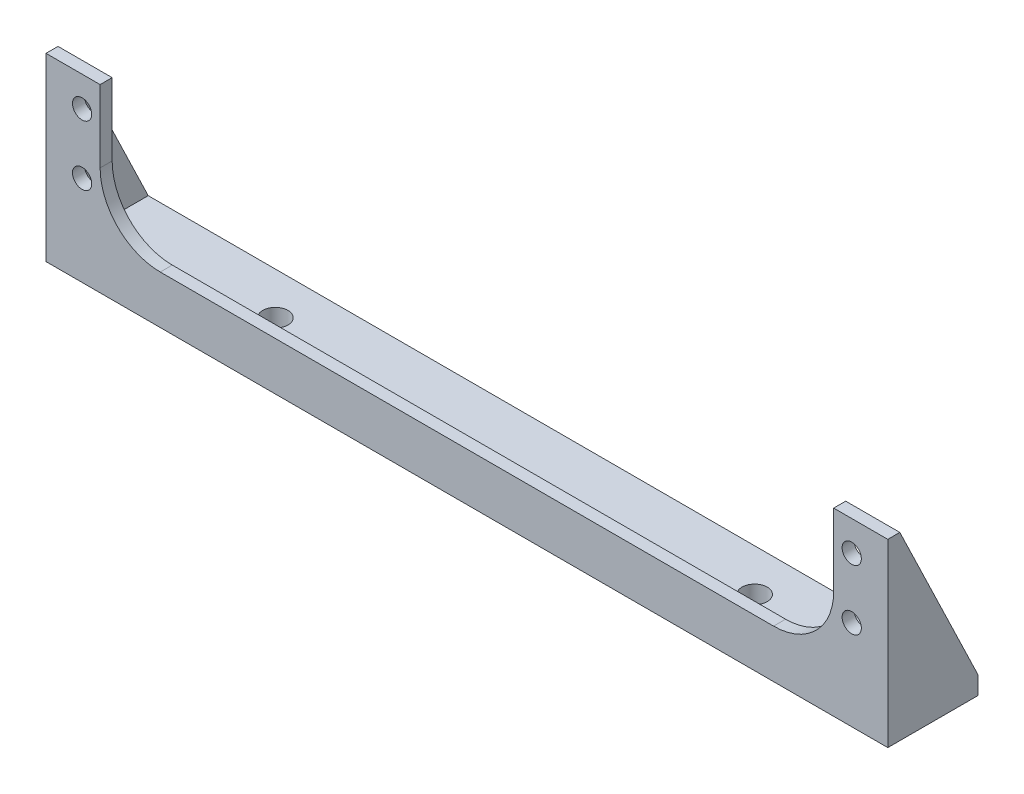
ISO-10303-21;
HEADER;
FILE_DESCRIPTION(('STEP AP214'),'2;1');
FILE_NAME('part.step','',(''),(''),'','','');
FILE_SCHEMA(('AUTOMOTIVE_DESIGN { 1 0 10303 214 1 1 1 1 }'));
ENDSEC;
DATA;
#1=APPLICATION_CONTEXT('core data for automotive mechanical design processes');
#2=APPLICATION_PROTOCOL_DEFINITION('international standard','automotive_design',2000,#1);
#3=PRODUCT_CONTEXT('',#1,'mechanical');
#4=PRODUCT('Part','Part','',(#3));
#5=PRODUCT_RELATED_PRODUCT_CATEGORY('part','',(#4));
#6=PRODUCT_DEFINITION_FORMATION('','',#4);
#7=PRODUCT_DEFINITION_CONTEXT('part definition',#1,'design');
#8=PRODUCT_DEFINITION('design','',#6,#7);
#9=PRODUCT_DEFINITION_SHAPE('','',#8);
#10=(LENGTH_UNIT() NAMED_UNIT(*) SI_UNIT(.MILLI.,.METRE.));
#11=(NAMED_UNIT(*) PLANE_ANGLE_UNIT() SI_UNIT($,.RADIAN.));
#12=(NAMED_UNIT(*) SI_UNIT($,.STERADIAN.) SOLID_ANGLE_UNIT());
#13=UNCERTAINTY_MEASURE_WITH_UNIT(LENGTH_MEASURE(1.E-05),#10,'distance_accuracy_value','');
#14=(GEOMETRIC_REPRESENTATION_CONTEXT(3) GLOBAL_UNCERTAINTY_ASSIGNED_CONTEXT((#13)) GLOBAL_UNIT_ASSIGNED_CONTEXT((#10,
#11,#12)) REPRESENTATION_CONTEXT('',''));
#15=CARTESIAN_POINT('',(0.,0.,0.));
#16=DIRECTION('',(0.,0.,1.));
#17=DIRECTION('',(1.,0.,0.));
#18=AXIS2_PLACEMENT_3D('',#15,#16,#17);
#19=CARTESIAN_POINT('',(-104.350253807107,3.,-17.8934010152284));
#20=DIRECTION('',(0.,-1.,0.));
#21=DIRECTION('',(0.,0.,-1.));
#22=AXIS2_PLACEMENT_3D('',#19,#20,#21);
#23=PLANE('',#22);
#24=CARTESIAN_POINT('',(-83.2002538071066,3.,4.10659898477157));
#25=DIRECTION('',(0.,1.,0.));
#26=DIRECTION('',(0.,0.,1.));
#27=AXIS2_PLACEMENT_3D('',#24,#25,#26);
#28=CIRCLE('',#27,2.1);
#29=CARTESIAN_POINT('',(-83.2002538071066,3.,6.20659898477158));
#30=VERTEX_POINT('',#29);
#31=EDGE_CURVE('E403',#30,#30,#28,.T.);
#32=ORIENTED_EDGE('',*,*,#31,.F.);
#33=EDGE_LOOP('',(#32));
#34=FACE_BOUND('',#33,.T.);
#35=CARTESIAN_POINT('',(-3.50025380710657,3.,4.10659898477157));
#36=DIRECTION('',(0.,1.,0.));
#37=DIRECTION('',(0.,0.,1.));
#38=AXIS2_PLACEMENT_3D('',#35,#36,#37);
#39=CIRCLE('',#38,2.1);
#40=CARTESIAN_POINT('',(-3.50025380710657,3.,6.20659898477157));
#41=VERTEX_POINT('',#40);
#42=EDGE_CURVE('E409',#41,#41,#39,.T.);
#43=ORIENTED_EDGE('',*,*,#42,.F.);
#44=EDGE_LOOP('',(#43));
#45=FACE_BOUND('',#44,.T.);
#46=DIRECTION('',(0.,0.,-1.));
#47=VECTOR('',#46,1.);
#48=CARTESIAN_POINT('',(-111.350253807107,3.,10.1065989847716));
#49=LINE('',#48,#47);
#50=CARTESIAN_POINT('',(-111.350253807107,3.,8.10659898477147));
#51=VERTEX_POINT('',#50);
#52=CARTESIAN_POINT('',(-111.350253807107,3.,-2.89340101522843));
#53=VERTEX_POINT('',#52);
#54=EDGE_CURVE('E260',#51,#53,#49,.T.);
#55=ORIENTED_EDGE('',*,*,#54,.F.);
#56=DIRECTION('',(-1.,0.,0.));
#57=VECTOR('',#56,1.);
#58=CARTESIAN_POINT('',(24.6497461928934,3.,8.10659898477134));
#59=LINE('',#58,#57);
#60=CARTESIAN_POINT('',(24.6497461928934,3.,8.10659898477134));
#61=VERTEX_POINT('',#60);
#62=EDGE_CURVE('E48',#51,#61,#59,.F.);
#63=ORIENTED_EDGE('',*,*,#62,.T.);
#64=DIRECTION('',(0.,0.,1.));
#65=VECTOR('',#64,1.);
#66=CARTESIAN_POINT('',(24.6497461928934,3.,10.1065989847714));
#67=LINE('',#66,#65);
#68=CARTESIAN_POINT('',(24.6497461928934,3.,-2.89340101522843));
#69=VERTEX_POINT('',#68);
#70=EDGE_CURVE('E259',#69,#61,#67,.T.);
#71=ORIENTED_EDGE('',*,*,#70,.F.);
#72=DIRECTION('',(1.,0.,0.));
#73=VECTOR('',#72,1.);
#74=CARTESIAN_POINT('',(-113.350253807107,3.,-2.89340101522843));
#75=LINE('',#74,#73);
#76=EDGE_CURVE('E170',#53,#69,#75,.T.);
#77=ORIENTED_EDGE('',*,*,#76,.F.);
#78=EDGE_LOOP('',(#55,#63,#71,#77));
#79=FACE_BOUND('',#78,.T.);
#80=ADVANCED_FACE('F39',(#34,#45,#79),#23,.F.);
#81=CARTESIAN_POINT('',(0.,30.,0.));
#82=DIRECTION('',(0.,1.,0.));
#83=DIRECTION('',(0.,0.,1.));
#84=AXIS2_PLACEMENT_3D('',#81,#82,#83);
#85=PLANE('',#84);
#86=DIRECTION('',(-1.,0.,0.));
#87=VECTOR('',#86,1.);
#88=CARTESIAN_POINT('',(26.6497461928934,30.,10.1065989847713));
#89=LINE('',#88,#87);
#90=CARTESIAN_POINT('',(-111.350253807107,30.,10.1065989847716));
#91=VERTEX_POINT('',#90);
#92=CARTESIAN_POINT('',(-113.350253807107,30.,10.1065989847715));
#93=VERTEX_POINT('',#92);
#94=EDGE_CURVE('E172',#91,#93,#89,.T.);
#95=ORIENTED_EDGE('',*,*,#94,.T.);
#96=DIRECTION('',(0.,0.,1.));
#97=VECTOR('',#96,1.);
#98=CARTESIAN_POINT('',(-113.350253807107,30.,-2.89340101522843));
#99=LINE('',#98,#97);
#100=CARTESIAN_POINT('',(-113.350253807107,30.,12.1065989847716));
#101=VERTEX_POINT('',#100);
#102=EDGE_CURVE('E286',#93,#101,#99,.T.);
#103=ORIENTED_EDGE('',*,*,#102,.T.);
#104=DIRECTION('',(1.,0.,0.));
#105=VECTOR('',#104,1.);
#106=CARTESIAN_POINT('',(-113.350253807107,30.,12.1065989847716));
#107=LINE('',#106,#105);
#108=CARTESIAN_POINT('',(-104.350253807107,30.,12.1065989847716));
#109=VERTEX_POINT('',#108);
#110=EDGE_CURVE('E291',#101,#109,#107,.T.);
#111=ORIENTED_EDGE('',*,*,#110,.T.);
#112=DIRECTION('',(0.,0.,1.));
#113=VECTOR('',#112,1.);
#114=CARTESIAN_POINT('',(-104.350253807107,30.,0.));
#115=LINE('',#114,#113);
#116=CARTESIAN_POINT('',(-104.350253807107,30.,10.1065989847715));
#117=VERTEX_POINT('',#116);
#118=EDGE_CURVE('E198',#117,#109,#115,.T.);
#119=ORIENTED_EDGE('',*,*,#118,.F.);
#120=DIRECTION('',(-1.,0.,0.));
#121=VECTOR('',#120,1.);
#122=CARTESIAN_POINT('',(26.6497461928934,30.,10.1065989847713));
#123=LINE('',#122,#121);
#124=EDGE_CURVE('E271',#117,#91,#123,.T.);
#125=ORIENTED_EDGE('',*,*,#124,.T.);
#126=EDGE_LOOP('',(#95,#103,#111,#119,#125));
#127=FACE_BOUND('',#126,.T.);
#128=ADVANCED_FACE('F347',(#127),#85,.T.);
#129=CARTESIAN_POINT('',(-113.350253807107,30.,-2.89340101522843));
#130=DIRECTION('',(1.,0.,0.));
#131=DIRECTION('',(0.,0.,-1.));
#132=AXIS2_PLACEMENT_3D('',#129,#130,#131);
#133=PLANE('',#132);
#134=ORIENTED_EDGE('',*,*,#102,.F.);
#135=DIRECTION('',(0.,0.901001669759101,0.433815618772897));
#136=VECTOR('',#135,1.);
#137=CARTESIAN_POINT('',(-113.350253807107,30.,10.1065989847715));
#138=LINE('',#137,#136);
#139=CARTESIAN_POINT('',(-113.350253807107,3.,-2.89340101522843));
#140=VERTEX_POINT('',#139);
#141=EDGE_CURVE('E159',#140,#93,#138,.T.);
#142=ORIENTED_EDGE('',*,*,#141,.F.);
#143=DIRECTION('',(0.,-1.,0.));
#144=VECTOR('',#143,1.);
#145=CARTESIAN_POINT('',(-113.350253807107,30.,-2.89340101522843));
#146=LINE('',#145,#144);
#147=CARTESIAN_POINT('',(-113.350253807107,0.,-2.89340101522843));
#148=VERTEX_POINT('',#147);
#149=EDGE_CURVE('E181',#140,#148,#146,.T.);
#150=ORIENTED_EDGE('',*,*,#149,.T.);
#151=DIRECTION('',(0.,0.,1.));
#152=VECTOR('',#151,1.);
#153=CARTESIAN_POINT('',(-113.350253807107,0.,-2.89340101522843));
#154=LINE('',#153,#152);
#155=CARTESIAN_POINT('',(-113.350253807107,0.,12.1065989847716));
#156=VERTEX_POINT('',#155);
#157=EDGE_CURVE('E285',#148,#156,#154,.T.);
#158=ORIENTED_EDGE('',*,*,#157,.T.);
#159=DIRECTION('',(0.,-1.,0.));
#160=VECTOR('',#159,1.);
#161=CARTESIAN_POINT('',(-113.350253807107,30.,12.1065989847716));
#162=LINE('',#161,#160);
#163=EDGE_CURVE('E185',#101,#156,#162,.T.);
#164=ORIENTED_EDGE('',*,*,#163,.F.);
#165=EDGE_LOOP('',(#134,#142,#150,#158,#164));
#166=FACE_BOUND('',#165,.T.);
#167=ADVANCED_FACE('F311',(#166),#133,.F.);
#168=CARTESIAN_POINT('',(-113.350253807107,30.,12.1065989847716));
#169=DIRECTION('',(0.,0.,-1.));
#170=DIRECTION('',(-1.,0.,0.));
#171=AXIS2_PLACEMENT_3D('',#168,#169,#170);
#172=PLANE('',#171);
#173=CARTESIAN_POINT('',(20.6497461928934,15.,12.1065989847716));
#174=DIRECTION('',(0.,0.,-1.));
#175=DIRECTION('',(-1.,0.,0.));
#176=AXIS2_PLACEMENT_3D('',#173,#174,#175);
#177=CIRCLE('',#176,1.6);
#178=CARTESIAN_POINT('',(19.0497461928934,15.,12.1065989847716));
#179=VERTEX_POINT('',#178);
#180=EDGE_CURVE('E433',#179,#179,#177,.T.);
#181=ORIENTED_EDGE('',*,*,#180,.T.);
#182=EDGE_LOOP('',(#181));
#183=FACE_BOUND('',#182,.T.);
#184=CARTESIAN_POINT('',(-107.350253807107,25.,12.1065989847717));
#185=DIRECTION('',(0.,0.,-1.));
#186=DIRECTION('',(-1.,0.,0.));
#187=AXIS2_PLACEMENT_3D('',#184,#185,#186);
#188=CIRCLE('',#187,1.6);
#189=CARTESIAN_POINT('',(-108.950253807107,25.,12.1065989847717));
#190=VERTEX_POINT('',#189);
#191=EDGE_CURVE('E441',#190,#190,#188,.T.);
#192=ORIENTED_EDGE('',*,*,#191,.T.);
#193=EDGE_LOOP('',(#192));
#194=FACE_BOUND('',#193,.T.);
#195=CARTESIAN_POINT('',(-107.350253807107,15.,12.1065989847717));
#196=DIRECTION('',(0.,0.,-1.));
#197=DIRECTION('',(-1.,0.,0.));
#198=AXIS2_PLACEMENT_3D('',#195,#196,#197);
#199=CIRCLE('',#198,1.6);
#200=CARTESIAN_POINT('',(-108.950253807107,15.,12.1065989847717));
#201=VERTEX_POINT('',#200);
#202=EDGE_CURVE('E425',#201,#201,#199,.T.);
#203=ORIENTED_EDGE('',*,*,#202,.T.);
#204=EDGE_LOOP('',(#203));
#205=FACE_BOUND('',#204,.T.);
#206=CARTESIAN_POINT('',(20.6497461928934,25.,12.1065989847716));
#207=DIRECTION('',(0.,0.,-1.));
#208=DIRECTION('',(-1.,0.,0.));
#209=AXIS2_PLACEMENT_3D('',#206,#207,#208);
#210=CIRCLE('',#209,1.6);
#211=CARTESIAN_POINT('',(19.0497461928934,25.,12.1065989847716));
#212=VERTEX_POINT('',#211);
#213=EDGE_CURVE('E316',#212,#212,#210,.T.);
#214=ORIENTED_EDGE('',*,*,#213,.T.);
#215=EDGE_LOOP('',(#214));
#216=FACE_BOUND('',#215,.T.);
#217=DIRECTION('',(1.,0.,0.));
#218=VECTOR('',#217,1.);
#219=CARTESIAN_POINT('',(17.6497461928934,8.,12.1065989847716));
#220=LINE('',#219,#218);
#221=CARTESIAN_POINT('',(-94.3502538071066,8.,12.1065989847716));
#222=VERTEX_POINT('',#221);
#223=CARTESIAN_POINT('',(7.64974619289341,8.,12.1065989847716));
#224=VERTEX_POINT('',#223);
#225=EDGE_CURVE('E399',#222,#224,#220,.T.);
#226=ORIENTED_EDGE('',*,*,#225,.F.);
#227=CARTESIAN_POINT('',(-94.3502538071066,18.,12.1065989847716));
#228=DIRECTION('',(0.,0.,-1.));
#229=DIRECTION('',(-1.,0.,0.));
#230=AXIS2_PLACEMENT_3D('',#227,#228,#229);
#231=CIRCLE('',#230,10.);
#232=CARTESIAN_POINT('',(-104.350253807107,18.,12.1065989847716));
#233=VERTEX_POINT('',#232);
#234=EDGE_CURVE('E231',#222,#233,#231,.T.);
#235=ORIENTED_EDGE('',*,*,#234,.T.);
#236=DIRECTION('',(0.,-1.,0.));
#237=VECTOR('',#236,1.);
#238=CARTESIAN_POINT('',(-104.350253807107,30.,12.1065989847716));
#239=LINE('',#238,#237);
#240=EDGE_CURVE('E278',#109,#233,#239,.T.);
#241=ORIENTED_EDGE('',*,*,#240,.F.);
#242=ORIENTED_EDGE('',*,*,#110,.F.);
#243=ORIENTED_EDGE('',*,*,#163,.T.);
#244=DIRECTION('',(1.,0.,0.));
#245=VECTOR('',#244,1.);
#246=CARTESIAN_POINT('',(-113.350253807107,0.,12.1065989847716));
#247=LINE('',#246,#245);
#248=CARTESIAN_POINT('',(26.6497461928934,0.,12.1065989847716));
#249=VERTEX_POINT('',#248);
#250=EDGE_CURVE('E300',#156,#249,#247,.T.);
#251=ORIENTED_EDGE('',*,*,#250,.T.);
#252=DIRECTION('',(0.,-1.,0.));
#253=VECTOR('',#252,1.);
#254=CARTESIAN_POINT('',(26.6497461928934,30.,12.1065989847716));
#255=LINE('',#254,#253);
#256=CARTESIAN_POINT('',(26.6497461928934,30.,12.1065989847716));
#257=VERTEX_POINT('',#256);
#258=EDGE_CURVE('E180',#257,#249,#255,.T.);
#259=ORIENTED_EDGE('',*,*,#258,.F.);
#260=CARTESIAN_POINT('',(17.6497461928934,30.,12.1065989847716));
#261=VERTEX_POINT('',#260);
#262=EDGE_CURVE('E289',#261,#257,#107,.T.);
#263=ORIENTED_EDGE('',*,*,#262,.F.);
#264=DIRECTION('',(0.,1.,0.));
#265=VECTOR('',#264,1.);
#266=CARTESIAN_POINT('',(17.6497461928934,30.,12.1065989847716));
#267=LINE('',#266,#265);
#268=CARTESIAN_POINT('',(17.6497461928934,18.,12.1065989847716));
#269=VERTEX_POINT('',#268);
#270=EDGE_CURVE('E282',#269,#261,#267,.T.);
#271=ORIENTED_EDGE('',*,*,#270,.F.);
#272=CARTESIAN_POINT('',(7.6497461928934,18.,12.1065989847716));
#273=DIRECTION('',(0.,0.,-1.));
#274=DIRECTION('',(-1.,0.,0.));
#275=AXIS2_PLACEMENT_3D('',#272,#273,#274);
#276=CIRCLE('',#275,10.);
#277=EDGE_CURVE('E228',#269,#224,#276,.T.);
#278=ORIENTED_EDGE('',*,*,#277,.T.);
#279=EDGE_LOOP('',(#226,#235,#241,#242,#243,#251,#259,#263,#271,#278));
#280=FACE_BOUND('',#279,.T.);
#281=ADVANCED_FACE('F340',(#183,#194,#205,#216,#280),#172,.F.);
#282=CARTESIAN_POINT('',(26.6497461928934,30.,-2.89340101522843));
#283=DIRECTION('',(-1.,0.,0.));
#284=DIRECTION('',(0.,0.,1.));
#285=AXIS2_PLACEMENT_3D('',#282,#283,#284);
#286=PLANE('',#285);
#287=DIRECTION('',(0.,-1.,0.));
#288=VECTOR('',#287,1.);
#289=CARTESIAN_POINT('',(26.6497461928934,30.,-2.89340101522843));
#290=LINE('',#289,#288);
#291=CARTESIAN_POINT('',(26.6497461928934,3.,-2.89340101522856));
#292=VERTEX_POINT('',#291);
#293=CARTESIAN_POINT('',(26.6497461928934,0.,-2.89340101522843));
#294=VERTEX_POINT('',#293);
#295=EDGE_CURVE('E166',#292,#294,#290,.T.);
#296=ORIENTED_EDGE('',*,*,#295,.F.);
#297=DIRECTION('',(0.,0.901001669759101,0.433815618772897));
#298=VECTOR('',#297,1.);
#299=CARTESIAN_POINT('',(26.6497461928934,30.,10.1065989847713));
#300=LINE('',#299,#298);
#301=CARTESIAN_POINT('',(26.6497461928934,30.,10.1065989847713));
#302=VERTEX_POINT('',#301);
#303=EDGE_CURVE('E145',#292,#302,#300,.T.);
#304=ORIENTED_EDGE('',*,*,#303,.T.);
#305=DIRECTION('',(0.,0.,-1.));
#306=VECTOR('',#305,1.);
#307=CARTESIAN_POINT('',(26.6497461928934,30.,-2.89340101522843));
#308=LINE('',#307,#306);
#309=EDGE_CURVE('E187',#257,#302,#308,.T.);
#310=ORIENTED_EDGE('',*,*,#309,.F.);
#311=ORIENTED_EDGE('',*,*,#258,.T.);
#312=DIRECTION('',(0.,0.,-1.));
#313=VECTOR('',#312,1.);
#314=CARTESIAN_POINT('',(26.6497461928934,0.,-2.89340101522843));
#315=LINE('',#314,#313);
#316=EDGE_CURVE('E177',#249,#294,#315,.T.);
#317=ORIENTED_EDGE('',*,*,#316,.T.);
#318=EDGE_LOOP('',(#296,#304,#310,#311,#317));
#319=FACE_BOUND('',#318,.T.);
#320=ADVANCED_FACE('F174',(#319),#286,.F.);
#321=CARTESIAN_POINT('',(-113.350253807107,30.,-2.89340101522843));
#322=DIRECTION('',(0.,0.,1.));
#323=DIRECTION('',(1.,0.,0.));
#324=AXIS2_PLACEMENT_3D('',#321,#322,#323);
#325=PLANE('',#324);
#326=ORIENTED_EDGE('',*,*,#149,.F.);
#327=DIRECTION('',(-1.,0.,0.));
#328=VECTOR('',#327,1.);
#329=CARTESIAN_POINT('',(26.6497461928934,3.,-2.89340101522856));
#330=LINE('',#329,#328);
#331=EDGE_CURVE('E158',#53,#140,#330,.T.);
#332=ORIENTED_EDGE('',*,*,#331,.F.);
#333=ORIENTED_EDGE('',*,*,#76,.T.);
#334=EDGE_CURVE('E149',#292,#69,#330,.T.);
#335=ORIENTED_EDGE('',*,*,#334,.F.);
#336=ORIENTED_EDGE('',*,*,#295,.T.);
#337=DIRECTION('',(-1.,0.,0.));
#338=VECTOR('',#337,1.);
#339=CARTESIAN_POINT('',(-113.350253807107,0.,-2.89340101522843));
#340=LINE('',#339,#338);
#341=EDGE_CURVE('E290',#294,#148,#340,.T.);
#342=ORIENTED_EDGE('',*,*,#341,.T.);
#343=EDGE_LOOP('',(#326,#332,#333,#335,#336,#342));
#344=FACE_BOUND('',#343,.T.);
#345=ADVANCED_FACE('F164',(#344),#325,.F.);
#346=CARTESIAN_POINT('',(24.6497461928934,30.,10.1065989847713));
#347=VERTEX_POINT('',#346);
#348=EDGE_CURVE('E152',#302,#347,#89,.T.);
#349=ORIENTED_EDGE('',*,*,#348,.T.);
#350=CARTESIAN_POINT('',(17.6497461928934,30.,10.1065989847713));
#351=VERTEX_POINT('',#350);
#352=EDGE_CURVE('E272',#347,#351,#123,.T.);
#353=ORIENTED_EDGE('',*,*,#352,.T.);
#354=DIRECTION('',(0.,0.,-1.));
#355=VECTOR('',#354,1.);
#356=CARTESIAN_POINT('',(17.6497461928934,30.,0.));
#357=LINE('',#356,#355);
#358=EDGE_CURVE('E194',#261,#351,#357,.T.);
#359=ORIENTED_EDGE('',*,*,#358,.F.);
#360=ORIENTED_EDGE('',*,*,#262,.T.);
#361=ORIENTED_EDGE('',*,*,#309,.T.);
#362=EDGE_LOOP('',(#349,#353,#359,#360,#361));
#363=FACE_BOUND('',#362,.T.);
#364=ADVANCED_FACE('F328',(#363),#85,.T.);
#365=CARTESIAN_POINT('',(0.,0.,0.));
#366=DIRECTION('',(0.,1.,0.));
#367=DIRECTION('',(0.,0.,1.));
#368=AXIS2_PLACEMENT_3D('',#365,#366,#367);
#369=PLANE('',#368);
#370=CARTESIAN_POINT('',(-3.50025380710657,0.,4.10659898477157));
#371=DIRECTION('',(0.,1.,0.));
#372=DIRECTION('',(0.,0.,1.));
#373=AXIS2_PLACEMENT_3D('',#370,#371,#372);
#374=CIRCLE('',#373,2.1);
#375=CARTESIAN_POINT('',(-3.50025380710657,0.,6.20659898477157));
#376=VERTEX_POINT('',#375);
#377=EDGE_CURVE('E420',#376,#376,#374,.T.);
#378=ORIENTED_EDGE('',*,*,#377,.T.);
#379=EDGE_LOOP('',(#378));
#380=FACE_BOUND('',#379,.T.);
#381=CARTESIAN_POINT('',(-83.2002538071066,0.,4.10659898477157));
#382=DIRECTION('',(0.,1.,0.));
#383=DIRECTION('',(0.,0.,1.));
#384=AXIS2_PLACEMENT_3D('',#381,#382,#383);
#385=CIRCLE('',#384,2.1);
#386=CARTESIAN_POINT('',(-83.2002538071066,0.,6.20659898477158));
#387=VERTEX_POINT('',#386);
#388=EDGE_CURVE('E415',#387,#387,#385,.T.);
#389=ORIENTED_EDGE('',*,*,#388,.T.);
#390=EDGE_LOOP('',(#389));
#391=FACE_BOUND('',#390,.T.);
#392=ORIENTED_EDGE('',*,*,#157,.F.);
#393=ORIENTED_EDGE('',*,*,#341,.F.);
#394=ORIENTED_EDGE('',*,*,#316,.F.);
#395=ORIENTED_EDGE('',*,*,#250,.F.);
#396=EDGE_LOOP('',(#392,#393,#394,#395));
#397=FACE_BOUND('',#396,.T.);
#398=ADVANCED_FACE('F307',(#380,#391,#397),#369,.F.);
#399=CARTESIAN_POINT('',(-104.350253807107,30.,-17.8934010152284));
#400=DIRECTION('',(-1.,0.,0.));
#401=DIRECTION('',(0.,0.,1.));
#402=AXIS2_PLACEMENT_3D('',#399,#400,#401);
#403=PLANE('',#402);
#404=ORIENTED_EDGE('',*,*,#240,.T.);
#405=DIRECTION('',(0.,0.,1.));
#406=VECTOR('',#405,1.);
#407=CARTESIAN_POINT('',(-104.350253807107,18.,-17.8934010152284));
#408=LINE('',#407,#406);
#409=CARTESIAN_POINT('',(-104.350253807107,18.,10.1065989847715));
#410=VERTEX_POINT('',#409);
#411=EDGE_CURVE('E222',#233,#410,#408,.F.);
#412=ORIENTED_EDGE('',*,*,#411,.T.);
#413=DIRECTION('',(0.,1.,0.));
#414=VECTOR('',#413,1.);
#415=CARTESIAN_POINT('',(-104.350253807107,30.,10.1065989847715));
#416=LINE('',#415,#414);
#417=EDGE_CURVE('E275',#410,#117,#416,.T.);
#418=ORIENTED_EDGE('',*,*,#417,.T.);
#419=ORIENTED_EDGE('',*,*,#118,.T.);
#420=EDGE_LOOP('',(#404,#412,#418,#419));
#421=FACE_BOUND('',#420,.T.);
#422=ADVANCED_FACE('F371',(#421),#403,.F.);
#423=CARTESIAN_POINT('',(17.6497461928934,30.,-17.8934010152284));
#424=DIRECTION('',(1.,0.,0.));
#425=DIRECTION('',(0.,0.,-1.));
#426=AXIS2_PLACEMENT_3D('',#423,#424,#425);
#427=PLANE('',#426);
#428=DIRECTION('',(0.,-1.,0.));
#429=VECTOR('',#428,1.);
#430=CARTESIAN_POINT('',(17.6497461928934,30.,10.1065989847713));
#431=LINE('',#430,#429);
#432=CARTESIAN_POINT('',(17.6497461928934,18.,10.1065989847713));
#433=VERTEX_POINT('',#432);
#434=EDGE_CURVE('E203',#351,#433,#431,.T.);
#435=ORIENTED_EDGE('',*,*,#434,.T.);
#436=DIRECTION('',(0.,0.,-1.));
#437=VECTOR('',#436,1.);
#438=CARTESIAN_POINT('',(17.6497461928934,18.,-17.8934010152284));
#439=LINE('',#438,#437);
#440=EDGE_CURVE('E219',#433,#269,#439,.F.);
#441=ORIENTED_EDGE('',*,*,#440,.T.);
#442=ORIENTED_EDGE('',*,*,#270,.T.);
#443=ORIENTED_EDGE('',*,*,#358,.T.);
#444=EDGE_LOOP('',(#435,#441,#442,#443));
#445=FACE_BOUND('',#444,.T.);
#446=ADVANCED_FACE('F334',(#445),#427,.F.);
#447=CARTESIAN_POINT('',(26.6497461928934,30.,10.1065989847713));
#448=DIRECTION('',(0.,0.,1.));
#449=DIRECTION('',(1.,0.,0.));
#450=AXIS2_PLACEMENT_3D('',#447,#448,#449);
#451=PLANE('',#450);
#452=CARTESIAN_POINT('',(-107.350253807107,25.,10.1065989847715));
#453=DIRECTION('',(0.,0.,-1.));
#454=DIRECTION('',(-1.,0.,0.));
#455=AXIS2_PLACEMENT_3D('',#452,#453,#454);
#456=CIRCLE('',#455,1.6);
#457=CARTESIAN_POINT('',(-108.950253807107,25.,10.1065989847715));
#458=VERTEX_POINT('',#457);
#459=EDGE_CURVE('E429',#458,#458,#456,.T.);
#460=ORIENTED_EDGE('',*,*,#459,.F.);
#461=EDGE_LOOP('',(#460));
#462=FACE_BOUND('',#461,.T.);
#463=CARTESIAN_POINT('',(-107.350253807107,15.,10.1065989847715));
#464=DIRECTION('',(0.,0.,-1.));
#465=DIRECTION('',(-1.,0.,0.));
#466=AXIS2_PLACEMENT_3D('',#463,#464,#465);
#467=CIRCLE('',#466,1.6);
#468=CARTESIAN_POINT('',(-108.950253807107,15.,10.1065989847715));
#469=VERTEX_POINT('',#468);
#470=EDGE_CURVE('E424',#469,#469,#467,.T.);
#471=ORIENTED_EDGE('',*,*,#470,.F.);
#472=EDGE_LOOP('',(#471));
#473=FACE_BOUND('',#472,.T.);
#474=DIRECTION('',(0.,1.,0.));
#475=VECTOR('',#474,1.);
#476=CARTESIAN_POINT('',(24.6497461928934,-0.00199999999999853,10.1065989847714));
#477=LINE('',#476,#475);
#478=CARTESIAN_POINT('',(24.6497461928934,5.,10.1065989847714));
#479=VERTEX_POINT('',#478);
#480=EDGE_CURVE('E252',#479,#347,#477,.T.);
#481=ORIENTED_EDGE('',*,*,#480,.F.);
#482=DIRECTION('',(-1.,0.,0.));
#483=VECTOR('',#482,1.);
#484=CARTESIAN_POINT('',(-111.350253807107,5.,10.1065989847715));
#485=LINE('',#484,#483);
#486=CARTESIAN_POINT('',(-111.350253807107,5.,10.1065989847716));
#487=VERTEX_POINT('',#486);
#488=EDGE_CURVE('E237',#479,#487,#485,.T.);
#489=ORIENTED_EDGE('',*,*,#488,.T.);
#490=DIRECTION('',(0.,1.,0.));
#491=VECTOR('',#490,1.);
#492=CARTESIAN_POINT('',(-111.350253807107,-0.00199999999999853,10.1065989847716));
#493=LINE('',#492,#491);
#494=EDGE_CURVE('E249',#487,#91,#493,.T.);
#495=ORIENTED_EDGE('',*,*,#494,.T.);
#496=ORIENTED_EDGE('',*,*,#124,.F.);
#497=ORIENTED_EDGE('',*,*,#417,.F.);
#498=CARTESIAN_POINT('',(-94.3502538071066,18.,10.1065989847715));
#499=DIRECTION('',(0.,0.,1.));
#500=DIRECTION('',(1.,0.,0.));
#501=AXIS2_PLACEMENT_3D('',#498,#499,#500);
#502=CIRCLE('',#501,10.);
#503=CARTESIAN_POINT('',(-94.3502538071066,8.,10.1065989847715));
#504=VERTEX_POINT('',#503);
#505=EDGE_CURVE('E234',#410,#504,#502,.T.);
#506=ORIENTED_EDGE('',*,*,#505,.T.);
#507=DIRECTION('',(-1.,0.,0.));
#508=VECTOR('',#507,1.);
#509=CARTESIAN_POINT('',(17.6497461928934,8.,10.1065989847715));
#510=LINE('',#509,#508);
#511=CARTESIAN_POINT('',(7.64974619289341,8.,10.1065989847715));
#512=VERTEX_POINT('',#511);
#513=EDGE_CURVE('E404',#512,#504,#510,.T.);
#514=ORIENTED_EDGE('',*,*,#513,.F.);
#515=CARTESIAN_POINT('',(7.6497461928934,18.,10.1065989847714));
#516=DIRECTION('',(0.,0.,1.));
#517=DIRECTION('',(1.,0.,0.));
#518=AXIS2_PLACEMENT_3D('',#515,#516,#517);
#519=CIRCLE('',#518,10.);
#520=EDGE_CURVE('E225',#512,#433,#519,.T.);
#521=ORIENTED_EDGE('',*,*,#520,.T.);
#522=ORIENTED_EDGE('',*,*,#434,.F.);
#523=ORIENTED_EDGE('',*,*,#352,.F.);
#524=EDGE_LOOP('',(#481,#489,#495,#496,#497,#506,#514,#521,#522,#523));
#525=FACE_BOUND('',#524,.T.);
#526=CARTESIAN_POINT('',(20.6497461928934,15.,10.1065989847713));
#527=DIRECTION('',(0.,0.,-1.));
#528=DIRECTION('',(-1.,0.,0.));
#529=AXIS2_PLACEMENT_3D('',#526,#527,#528);
#530=CIRCLE('',#529,1.6);
#531=CARTESIAN_POINT('',(19.0497461928934,15.,10.1065989847713));
#532=VERTEX_POINT('',#531);
#533=EDGE_CURVE('E437',#532,#532,#530,.T.);
#534=ORIENTED_EDGE('',*,*,#533,.F.);
#535=EDGE_LOOP('',(#534));
#536=FACE_BOUND('',#535,.T.);
#537=CARTESIAN_POINT('',(20.6497461928934,25.,10.1065989847713));
#538=DIRECTION('',(0.,0.,-1.));
#539=DIRECTION('',(-1.,0.,0.));
#540=AXIS2_PLACEMENT_3D('',#537,#538,#539);
#541=CIRCLE('',#540,1.6);
#542=CARTESIAN_POINT('',(19.0497461928934,25.,10.1065989847713));
#543=VERTEX_POINT('',#542);
#544=EDGE_CURVE('E320',#543,#543,#541,.T.);
#545=ORIENTED_EDGE('',*,*,#544,.F.);
#546=EDGE_LOOP('',(#545));
#547=FACE_BOUND('',#546,.T.);
#548=ADVANCED_FACE('F246',(#462,#473,#525,#536,#547),#451,.F.);
#549=CARTESIAN_POINT('',(24.6497461928934,-0.00199999999999853,10.1065989847714));
#550=DIRECTION('',(-1.,0.,0.));
#551=DIRECTION('',(0.,0.,1.));
#552=AXIS2_PLACEMENT_3D('',#549,#550,#551);
#553=PLANE('',#552);
#554=ORIENTED_EDGE('',*,*,#70,.T.);
#555=CARTESIAN_POINT('',(24.6497461928934,5.,8.10659898477134));
#556=DIRECTION('',(-1.,0.,0.));
#557=DIRECTION('',(0.,0.,1.));
#558=AXIS2_PLACEMENT_3D('',#555,#556,#557);
#559=CIRCLE('',#558,2.);
#560=EDGE_CURVE('E11',#61,#479,#559,.T.);
#561=ORIENTED_EDGE('',*,*,#560,.T.);
#562=ORIENTED_EDGE('',*,*,#480,.T.);
#563=DIRECTION('',(0.,0.901001669759101,0.433815618772897));
#564=VECTOR('',#563,1.);
#565=CARTESIAN_POINT('',(24.6497461928934,5.64425612472157,-1.62024065888114));
#566=LINE('',#565,#564);
#567=EDGE_CURVE('E265',#69,#347,#566,.T.);
#568=ORIENTED_EDGE('',*,*,#567,.F.);
#569=EDGE_LOOP('',(#554,#561,#562,#568));
#570=FACE_BOUND('',#569,.T.);
#571=ADVANCED_FACE('F351',(#570),#553,.T.);
#572=CARTESIAN_POINT('',(-111.350253807107,-0.00199999999999853,10.1065989847716));
#573=DIRECTION('',(1.,0.,0.));
#574=DIRECTION('',(0.,0.,-1.));
#575=AXIS2_PLACEMENT_3D('',#572,#573,#574);
#576=PLANE('',#575);
#577=ORIENTED_EDGE('',*,*,#494,.F.);
#578=CARTESIAN_POINT('',(-111.350253807107,5.,8.10659898477147));
#579=DIRECTION('',(1.,0.,0.));
#580=DIRECTION('',(0.,0.,-1.));
#581=AXIS2_PLACEMENT_3D('',#578,#579,#580);
#582=CIRCLE('',#581,2.);
#583=EDGE_CURVE('E62',#487,#51,#582,.T.);
#584=ORIENTED_EDGE('',*,*,#583,.T.);
#585=ORIENTED_EDGE('',*,*,#54,.T.);
#586=DIRECTION('',(0.,-0.901001669759101,-0.433815618772897));
#587=VECTOR('',#586,1.);
#588=CARTESIAN_POINT('',(-111.350253807107,5.64425612472157,-1.62024065888102));
#589=LINE('',#588,#587);
#590=EDGE_CURVE('E207',#91,#53,#589,.T.);
#591=ORIENTED_EDGE('',*,*,#590,.F.);
#592=EDGE_LOOP('',(#577,#584,#585,#591));
#593=FACE_BOUND('',#592,.T.);
#594=ADVANCED_FACE('F256',(#593),#576,.T.);
#595=CARTESIAN_POINT('',(26.6497461928934,30.,10.1065989847713));
#596=DIRECTION('',(0.,-0.433815618772897,0.901001669759101));
#597=DIRECTION('',(0.,-0.901001669759101,-0.433815618772897));
#598=AXIS2_PLACEMENT_3D('',#595,#596,#597);
#599=PLANE('',#598);
#600=ORIENTED_EDGE('',*,*,#590,.T.);
#601=ORIENTED_EDGE('',*,*,#331,.T.);
#602=ORIENTED_EDGE('',*,*,#141,.T.);
#603=ORIENTED_EDGE('',*,*,#94,.F.);
#604=EDGE_LOOP('',(#600,#601,#602,#603));
#605=FACE_BOUND('',#604,.T.);
#606=ADVANCED_FACE('F350',(#605),#599,.F.);
#607=ORIENTED_EDGE('',*,*,#567,.T.);
#608=ORIENTED_EDGE('',*,*,#348,.F.);
#609=ORIENTED_EDGE('',*,*,#303,.F.);
#610=ORIENTED_EDGE('',*,*,#334,.T.);
#611=EDGE_LOOP('',(#607,#608,#609,#610));
#612=FACE_BOUND('',#611,.T.);
#613=ADVANCED_FACE('F148',(#612),#599,.F.);
#614=CARTESIAN_POINT('',(-107.350253807107,15.,12.1065989847717));
#615=DIRECTION('',(0.,0.,-1.));
#616=DIRECTION('',(-1.,0.,0.));
#617=AXIS2_PLACEMENT_3D('',#614,#615,#616);
#618=CYLINDRICAL_SURFACE('',#617,1.6);
#619=ORIENTED_EDGE('',*,*,#202,.F.);
#620=EDGE_LOOP('',(#619));
#621=FACE_BOUND('',#620,.T.);
#622=ORIENTED_EDGE('',*,*,#470,.T.);
#623=EDGE_LOOP('',(#622));
#624=FACE_BOUND('',#623,.T.);
#625=ADVANCED_FACE('F474',(#621,#624),#618,.F.);
#626=CARTESIAN_POINT('',(-107.350253807107,25.,12.1065989847717));
#627=DIRECTION('',(0.,0.,-1.));
#628=DIRECTION('',(-1.,0.,0.));
#629=AXIS2_PLACEMENT_3D('',#626,#627,#628);
#630=CYLINDRICAL_SURFACE('',#629,1.6);
#631=ORIENTED_EDGE('',*,*,#191,.F.);
#632=EDGE_LOOP('',(#631));
#633=FACE_BOUND('',#632,.T.);
#634=ORIENTED_EDGE('',*,*,#459,.T.);
#635=EDGE_LOOP('',(#634));
#636=FACE_BOUND('',#635,.T.);
#637=ADVANCED_FACE('F470',(#633,#636),#630,.F.);
#638=CARTESIAN_POINT('',(20.6497461928934,25.,12.1065989847716));
#639=DIRECTION('',(0.,0.,-1.));
#640=DIRECTION('',(-1.,0.,0.));
#641=AXIS2_PLACEMENT_3D('',#638,#639,#640);
#642=CYLINDRICAL_SURFACE('',#641,1.6);
#643=ORIENTED_EDGE('',*,*,#213,.F.);
#644=EDGE_LOOP('',(#643));
#645=FACE_BOUND('',#644,.T.);
#646=ORIENTED_EDGE('',*,*,#544,.T.);
#647=EDGE_LOOP('',(#646));
#648=FACE_BOUND('',#647,.T.);
#649=ADVANCED_FACE('F451',(#645,#648),#642,.F.);
#650=CARTESIAN_POINT('',(20.6497461928934,15.,12.1065989847716));
#651=DIRECTION('',(0.,0.,-1.));
#652=DIRECTION('',(-1.,0.,0.));
#653=AXIS2_PLACEMENT_3D('',#650,#651,#652);
#654=CYLINDRICAL_SURFACE('',#653,1.6);
#655=ORIENTED_EDGE('',*,*,#180,.F.);
#656=EDGE_LOOP('',(#655));
#657=FACE_BOUND('',#656,.T.);
#658=ORIENTED_EDGE('',*,*,#533,.T.);
#659=EDGE_LOOP('',(#658));
#660=FACE_BOUND('',#659,.T.);
#661=ADVANCED_FACE('F469',(#657,#660),#654,.F.);
#662=CARTESIAN_POINT('',(-83.2002538071066,-27.,4.10659898477157));
#663=DIRECTION('',(0.,1.,0.));
#664=DIRECTION('',(0.,0.,1.));
#665=AXIS2_PLACEMENT_3D('',#662,#663,#664);
#666=CYLINDRICAL_SURFACE('',#665,2.1);
#667=ORIENTED_EDGE('',*,*,#31,.T.);
#668=EDGE_LOOP('',(#667));
#669=FACE_BOUND('',#668,.T.);
#670=ORIENTED_EDGE('',*,*,#388,.F.);
#671=EDGE_LOOP('',(#670));
#672=FACE_BOUND('',#671,.T.);
#673=ADVANCED_FACE('F478',(#669,#672),#666,.F.);
#674=CARTESIAN_POINT('',(-3.50025380710657,-27.,4.10659898477157));
#675=DIRECTION('',(0.,1.,0.));
#676=DIRECTION('',(0.,0.,1.));
#677=AXIS2_PLACEMENT_3D('',#674,#675,#676);
#678=CYLINDRICAL_SURFACE('',#677,2.1);
#679=ORIENTED_EDGE('',*,*,#42,.T.);
#680=EDGE_LOOP('',(#679));
#681=FACE_BOUND('',#680,.T.);
#682=ORIENTED_EDGE('',*,*,#377,.F.);
#683=EDGE_LOOP('',(#682));
#684=FACE_BOUND('',#683,.T.);
#685=ADVANCED_FACE('F394',(#681,#684),#678,.F.);
#686=CARTESIAN_POINT('',(0.,8.,0.));
#687=DIRECTION('',(0.,1.,0.));
#688=DIRECTION('',(0.,0.,1.));
#689=AXIS2_PLACEMENT_3D('',#686,#687,#688);
#690=PLANE('',#689);
#691=ORIENTED_EDGE('',*,*,#225,.T.);
#692=DIRECTION('',(0.,0.,-1.));
#693=VECTOR('',#692,1.);
#694=CARTESIAN_POINT('',(7.6497461928934,8.,0.));
#695=LINE('',#694,#693);
#696=EDGE_CURVE('E215',#224,#512,#695,.T.);
#697=ORIENTED_EDGE('',*,*,#696,.T.);
#698=ORIENTED_EDGE('',*,*,#513,.T.);
#699=DIRECTION('',(0.,0.,1.));
#700=VECTOR('',#699,1.);
#701=CARTESIAN_POINT('',(-94.3502538071066,8.,0.));
#702=LINE('',#701,#700);
#703=EDGE_CURVE('E211',#504,#222,#702,.T.);
#704=ORIENTED_EDGE('',*,*,#703,.T.);
#705=EDGE_LOOP('',(#691,#697,#698,#704));
#706=FACE_BOUND('',#705,.T.);
#707=ADVANCED_FACE('F389',(#706),#690,.T.);
#708=CARTESIAN_POINT('',(7.6497461928934,18.,0.));
#709=DIRECTION('',(0.,0.,-1.));
#710=DIRECTION('',(-1.,0.,0.));
#711=AXIS2_PLACEMENT_3D('',#708,#709,#710);
#712=CYLINDRICAL_SURFACE('',#711,10.);
#713=ORIENTED_EDGE('',*,*,#277,.F.);
#714=ORIENTED_EDGE('',*,*,#440,.F.);
#715=ORIENTED_EDGE('',*,*,#520,.F.);
#716=ORIENTED_EDGE('',*,*,#696,.F.);
#717=EDGE_LOOP('',(#713,#714,#715,#716));
#718=FACE_BOUND('',#717,.T.);
#719=ADVANCED_FACE('F357',(#718),#712,.F.);
#720=CARTESIAN_POINT('',(-94.3502538071066,18.,0.));
#721=DIRECTION('',(0.,0.,1.));
#722=DIRECTION('',(1.,0.,0.));
#723=AXIS2_PLACEMENT_3D('',#720,#721,#722);
#724=CYLINDRICAL_SURFACE('',#723,10.);
#725=ORIENTED_EDGE('',*,*,#505,.F.);
#726=ORIENTED_EDGE('',*,*,#411,.F.);
#727=ORIENTED_EDGE('',*,*,#234,.F.);
#728=ORIENTED_EDGE('',*,*,#703,.F.);
#729=EDGE_LOOP('',(#725,#726,#727,#728));
#730=FACE_BOUND('',#729,.T.);
#731=ADVANCED_FACE('F353',(#730),#724,.F.);
#732=CARTESIAN_POINT('',(26.6497461928934,5.,8.10659898477134));
#733=DIRECTION('',(1.,0.,0.));
#734=DIRECTION('',(0.,0.,-1.));
#735=AXIS2_PLACEMENT_3D('',#732,#733,#734);
#736=CYLINDRICAL_SURFACE('',#735,2.);
#737=ORIENTED_EDGE('',*,*,#560,.F.);
#738=ORIENTED_EDGE('',*,*,#62,.F.);
#739=ORIENTED_EDGE('',*,*,#583,.F.);
#740=ORIENTED_EDGE('',*,*,#488,.F.);
#741=EDGE_LOOP('',(#737,#738,#739,#740));
#742=FACE_BOUND('',#741,.T.);
#743=ADVANCED_FACE('F41',(#742),#736,.F.);
#744=CLOSED_SHELL('',(#80,#128,#167,#281,#320,#345,#364,#398,#422,#446,#548,#571,#594,#606,#613,
#625,#637,#649,#661,#673,#685,#707,#719,#731,#743));
#745=MANIFOLD_SOLID_BREP('B2',#744);
#746=ADVANCED_BREP_SHAPE_REPRESENTATION('',(#18,#745),#14);
#747=SHAPE_DEFINITION_REPRESENTATION(#9,#746);
ENDSEC;
END-ISO-10303-21;
